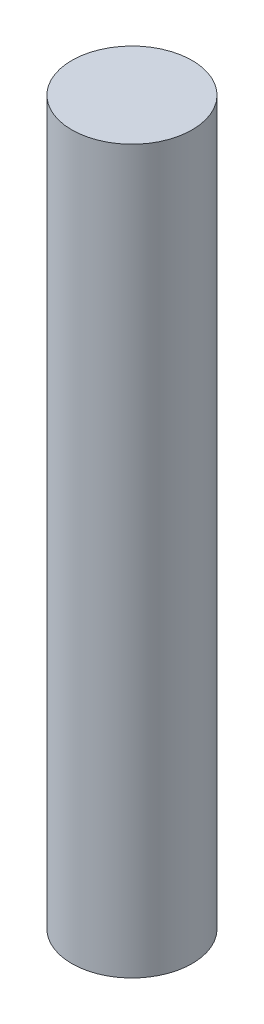
ISO-10303-21;
HEADER;
FILE_DESCRIPTION(('STEP AP214'),'2;1');
FILE_NAME('part.step','',(''),(''),'','','');
FILE_SCHEMA(('AUTOMOTIVE_DESIGN { 1 0 10303 214 1 1 1 1 }'));
ENDSEC;
DATA;
#1=APPLICATION_CONTEXT('core data for automotive mechanical design processes');
#2=APPLICATION_PROTOCOL_DEFINITION('international standard','automotive_design',2000,#1);
#3=PRODUCT_CONTEXT('',#1,'mechanical');
#4=PRODUCT('Part','Part','',(#3));
#5=PRODUCT_RELATED_PRODUCT_CATEGORY('part','',(#4));
#6=PRODUCT_DEFINITION_FORMATION('','',#4);
#7=PRODUCT_DEFINITION_CONTEXT('part definition',#1,'design');
#8=PRODUCT_DEFINITION('design','',#6,#7);
#9=PRODUCT_DEFINITION_SHAPE('','',#8);
#10=(LENGTH_UNIT() NAMED_UNIT(*) SI_UNIT(.MILLI.,.METRE.));
#11=(NAMED_UNIT(*) PLANE_ANGLE_UNIT() SI_UNIT($,.RADIAN.));
#12=(NAMED_UNIT(*) SI_UNIT($,.STERADIAN.) SOLID_ANGLE_UNIT());
#13=UNCERTAINTY_MEASURE_WITH_UNIT(LENGTH_MEASURE(1.E-05),#10,'distance_accuracy_value','');
#14=(GEOMETRIC_REPRESENTATION_CONTEXT(3) GLOBAL_UNCERTAINTY_ASSIGNED_CONTEXT((#13)) GLOBAL_UNIT_ASSIGNED_CONTEXT((#10,
#11,#12)) REPRESENTATION_CONTEXT('',''));
#15=CARTESIAN_POINT('',(0.,0.,0.));
#16=DIRECTION('',(0.,0.,1.));
#17=DIRECTION('',(1.,0.,0.));
#18=AXIS2_PLACEMENT_3D('',#15,#16,#17);
#19=CARTESIAN_POINT('',(0.,48.,0.));
#20=DIRECTION('',(0.,-1.,0.));
#21=DIRECTION('',(0.,0.,-1.));
#22=AXIS2_PLACEMENT_3D('',#19,#20,#21);
#23=CYLINDRICAL_SURFACE('',#22,4.);
#24=CARTESIAN_POINT('',(0.,48.,0.));
#25=DIRECTION('',(0.,1.,0.));
#26=DIRECTION('',(0.,0.,1.));
#27=AXIS2_PLACEMENT_3D('',#24,#25,#26);
#28=CIRCLE('',#27,4.);
#29=CARTESIAN_POINT('',(0.,48.,4.));
#30=VERTEX_POINT('',#29);
#31=EDGE_CURVE('E10',#30,#30,#28,.T.);
#32=ORIENTED_EDGE('',*,*,#31,.F.);
#33=EDGE_LOOP('',(#32));
#34=FACE_BOUND('',#33,.T.);
#35=CARTESIAN_POINT('',(0.,0.,0.));
#36=DIRECTION('',(0.,1.,0.));
#37=DIRECTION('',(0.,0.,1.));
#38=AXIS2_PLACEMENT_3D('',#35,#36,#37);
#39=CIRCLE('',#38,4.);
#40=CARTESIAN_POINT('',(0.,0.,4.));
#41=VERTEX_POINT('',#40);
#42=EDGE_CURVE('E34',#41,#41,#39,.T.);
#43=ORIENTED_EDGE('',*,*,#42,.T.);
#44=EDGE_LOOP('',(#43));
#45=FACE_BOUND('',#44,.T.);
#46=ADVANCED_FACE('F31',(#34,#45),#23,.T.);
#47=CARTESIAN_POINT('',(0.,48.,0.));
#48=DIRECTION('',(0.,1.,0.));
#49=DIRECTION('',(0.,0.,1.));
#50=AXIS2_PLACEMENT_3D('',#47,#48,#49);
#51=PLANE('',#50);
#52=ORIENTED_EDGE('',*,*,#31,.T.);
#53=EDGE_LOOP('',(#52));
#54=FACE_BOUND('',#53,.T.);
#55=ADVANCED_FACE('F46',(#54),#51,.T.);
#56=CARTESIAN_POINT('',(0.,0.,0.));
#57=DIRECTION('',(0.,1.,0.));
#58=DIRECTION('',(0.,0.,1.));
#59=AXIS2_PLACEMENT_3D('',#56,#57,#58);
#60=PLANE('',#59);
#61=ORIENTED_EDGE('',*,*,#42,.F.);
#62=EDGE_LOOP('',(#61));
#63=FACE_BOUND('',#62,.T.);
#64=ADVANCED_FACE('F44',(#63),#60,.F.);
#65=CLOSED_SHELL('',(#46,#55,#64));
#66=MANIFOLD_SOLID_BREP('B2',#65);
#67=ADVANCED_BREP_SHAPE_REPRESENTATION('',(#18,#66),#14);
#68=SHAPE_DEFINITION_REPRESENTATION(#9,#67);
ENDSEC;
END-ISO-10303-21;
